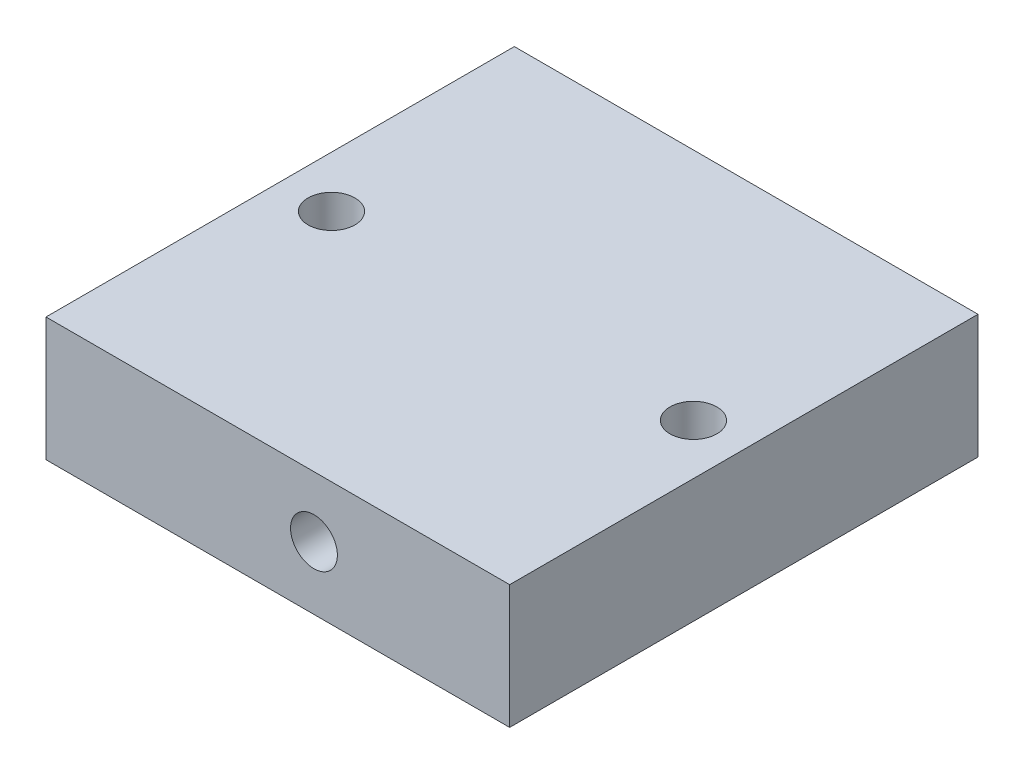
ISO-10303-21;
HEADER;
FILE_DESCRIPTION(('STEP AP214'),'2;1');
FILE_NAME('part.step','',(''),(''),'','','');
FILE_SCHEMA(('AUTOMOTIVE_DESIGN { 1 0 10303 214 1 1 1 1 }'));
ENDSEC;
DATA;
#1=APPLICATION_CONTEXT('core data for automotive mechanical design processes');
#2=APPLICATION_PROTOCOL_DEFINITION('international standard','automotive_design',2000,#1);
#3=PRODUCT_CONTEXT('',#1,'mechanical');
#4=PRODUCT('Part','Part','',(#3));
#5=PRODUCT_RELATED_PRODUCT_CATEGORY('part','',(#4));
#6=PRODUCT_DEFINITION_FORMATION('','',#4);
#7=PRODUCT_DEFINITION_CONTEXT('part definition',#1,'design');
#8=PRODUCT_DEFINITION('design','',#6,#7);
#9=PRODUCT_DEFINITION_SHAPE('','',#8);
#10=(LENGTH_UNIT() NAMED_UNIT(*) SI_UNIT(.MILLI.,.METRE.));
#11=(NAMED_UNIT(*) PLANE_ANGLE_UNIT() SI_UNIT($,.RADIAN.));
#12=(NAMED_UNIT(*) SI_UNIT($,.STERADIAN.) SOLID_ANGLE_UNIT());
#13=UNCERTAINTY_MEASURE_WITH_UNIT(LENGTH_MEASURE(1.E-05),#10,'distance_accuracy_value','');
#14=(GEOMETRIC_REPRESENTATION_CONTEXT(3) GLOBAL_UNCERTAINTY_ASSIGNED_CONTEXT((#13)) GLOBAL_UNIT_ASSIGNED_CONTEXT((#10,
#11,#12)) REPRESENTATION_CONTEXT('',''));
#15=CARTESIAN_POINT('',(0.,0.,0.));
#16=DIRECTION('',(0.,0.,1.));
#17=DIRECTION('',(1.,0.,0.));
#18=AXIS2_PLACEMENT_3D('',#15,#16,#17);
#19=CARTESIAN_POINT('',(247.5,132.,250.));
#20=DIRECTION('',(-1.,0.,0.));
#21=DIRECTION('',(0.,0.,1.));
#22=AXIS2_PLACEMENT_3D('',#19,#20,#21);
#23=PLANE('',#22);
#24=DIRECTION('',(0.,0.,-1.));
#25=VECTOR('',#24,1.);
#26=CARTESIAN_POINT('',(247.5,0.,250.));
#27=LINE('',#26,#25);
#28=CARTESIAN_POINT('',(247.5,0.,250.));
#29=VERTEX_POINT('',#28);
#30=CARTESIAN_POINT('',(247.5,0.,-250.));
#31=VERTEX_POINT('',#30);
#32=EDGE_CURVE('E97',#29,#31,#27,.T.);
#33=ORIENTED_EDGE('',*,*,#32,.T.);
#34=DIRECTION('',(0.,-1.,0.));
#35=VECTOR('',#34,1.);
#36=CARTESIAN_POINT('',(247.5,132.,-250.));
#37=LINE('',#36,#35);
#38=CARTESIAN_POINT('',(247.5,132.,-250.));
#39=VERTEX_POINT('',#38);
#40=EDGE_CURVE('E11',#39,#31,#37,.T.);
#41=ORIENTED_EDGE('',*,*,#40,.F.);
#42=DIRECTION('',(0.,0.,-1.));
#43=VECTOR('',#42,1.);
#44=CARTESIAN_POINT('',(247.5,132.,250.));
#45=LINE('',#44,#43);
#46=CARTESIAN_POINT('',(247.5,132.,250.));
#47=VERTEX_POINT('',#46);
#48=EDGE_CURVE('E85',#47,#39,#45,.T.);
#49=ORIENTED_EDGE('',*,*,#48,.F.);
#50=DIRECTION('',(0.,-1.,0.));
#51=VECTOR('',#50,1.);
#52=CARTESIAN_POINT('',(247.5,132.,250.));
#53=LINE('',#52,#51);
#54=EDGE_CURVE('E93',#47,#29,#53,.T.);
#55=ORIENTED_EDGE('',*,*,#54,.T.);
#56=EDGE_LOOP('',(#33,#41,#49,#55));
#57=FACE_BOUND('',#56,.T.);
#58=ADVANCED_FACE('F34',(#57),#23,.F.);
#59=CARTESIAN_POINT('',(-247.5,132.,-250.));
#60=DIRECTION('',(0.,0.,1.));
#61=DIRECTION('',(1.,0.,0.));
#62=AXIS2_PLACEMENT_3D('',#59,#60,#61);
#63=PLANE('',#62);
#64=CARTESIAN_POINT('',(38.5868696304628,67.2852031451336,-250.));
#65=DIRECTION('',(0.,0.,1.));
#66=DIRECTION('',(1.,0.,0.));
#67=AXIS2_PLACEMENT_3D('',#64,#65,#66);
#68=CIRCLE('',#67,25.);
#69=CARTESIAN_POINT('',(63.5868696304628,67.2852031451336,-250.));
#70=VERTEX_POINT('',#69);
#71=EDGE_CURVE('E100',#70,#70,#68,.T.);
#72=ORIENTED_EDGE('',*,*,#71,.T.);
#73=EDGE_LOOP('',(#72));
#74=FACE_BOUND('',#73,.T.);
#75=DIRECTION('',(-1.,0.,0.));
#76=VECTOR('',#75,1.);
#77=CARTESIAN_POINT('',(-247.5,0.,-250.));
#78=LINE('',#77,#76);
#79=CARTESIAN_POINT('',(-247.5,0.,-250.));
#80=VERTEX_POINT('',#79);
#81=EDGE_CURVE('E89',#31,#80,#78,.T.);
#82=ORIENTED_EDGE('',*,*,#81,.T.);
#83=DIRECTION('',(0.,-1.,0.));
#84=VECTOR('',#83,1.);
#85=CARTESIAN_POINT('',(-247.5,132.,-250.));
#86=LINE('',#85,#84);
#87=CARTESIAN_POINT('',(-247.5,132.,-250.));
#88=VERTEX_POINT('',#87);
#89=EDGE_CURVE('E42',#88,#80,#86,.T.);
#90=ORIENTED_EDGE('',*,*,#89,.F.);
#91=DIRECTION('',(-1.,0.,0.));
#92=VECTOR('',#91,1.);
#93=CARTESIAN_POINT('',(-247.5,132.,-250.));
#94=LINE('',#93,#92);
#95=EDGE_CURVE('E80',#39,#88,#94,.T.);
#96=ORIENTED_EDGE('',*,*,#95,.F.);
#97=ORIENTED_EDGE('',*,*,#40,.T.);
#98=EDGE_LOOP('',(#82,#90,#96,#97));
#99=FACE_BOUND('',#98,.T.);
#100=ADVANCED_FACE('F88',(#74,#99),#63,.F.);
#101=CARTESIAN_POINT('',(-247.5,132.,250.));
#102=DIRECTION('',(1.,0.,0.));
#103=DIRECTION('',(0.,0.,-1.));
#104=AXIS2_PLACEMENT_3D('',#101,#102,#103);
#105=PLANE('',#104);
#106=DIRECTION('',(0.,0.,1.));
#107=VECTOR('',#106,1.);
#108=CARTESIAN_POINT('',(-247.5,0.,250.));
#109=LINE('',#108,#107);
#110=CARTESIAN_POINT('',(-247.5,0.,250.));
#111=VERTEX_POINT('',#110);
#112=EDGE_CURVE('E67',#80,#111,#109,.T.);
#113=ORIENTED_EDGE('',*,*,#112,.T.);
#114=DIRECTION('',(0.,-1.,0.));
#115=VECTOR('',#114,1.);
#116=CARTESIAN_POINT('',(-247.5,132.,250.));
#117=LINE('',#116,#115);
#118=CARTESIAN_POINT('',(-247.5,132.,250.));
#119=VERTEX_POINT('',#118);
#120=EDGE_CURVE('E90',#119,#111,#117,.T.);
#121=ORIENTED_EDGE('',*,*,#120,.F.);
#122=DIRECTION('',(0.,0.,1.));
#123=VECTOR('',#122,1.);
#124=CARTESIAN_POINT('',(-247.5,132.,250.));
#125=LINE('',#124,#123);
#126=EDGE_CURVE('E83',#88,#119,#125,.T.);
#127=ORIENTED_EDGE('',*,*,#126,.F.);
#128=ORIENTED_EDGE('',*,*,#89,.T.);
#129=EDGE_LOOP('',(#113,#121,#127,#128));
#130=FACE_BOUND('',#129,.T.);
#131=ADVANCED_FACE('F91',(#130),#105,.F.);
#132=CARTESIAN_POINT('',(-247.5,132.,250.));
#133=DIRECTION('',(0.,0.,-1.));
#134=DIRECTION('',(-1.,0.,0.));
#135=AXIS2_PLACEMENT_3D('',#132,#133,#134);
#136=PLANE('',#135);
#137=CARTESIAN_POINT('',(38.5868696304628,67.2852031451336,250.));
#138=DIRECTION('',(0.,0.,1.));
#139=DIRECTION('',(1.,0.,0.));
#140=AXIS2_PLACEMENT_3D('',#137,#138,#139);
#141=CIRCLE('',#140,25.);
#142=CARTESIAN_POINT('',(63.5868696304628,67.2852031451336,250.));
#143=VERTEX_POINT('',#142);
#144=EDGE_CURVE('E111',#143,#143,#141,.T.);
#145=ORIENTED_EDGE('',*,*,#144,.F.);
#146=EDGE_LOOP('',(#145));
#147=FACE_BOUND('',#146,.T.);
#148=DIRECTION('',(1.,0.,0.));
#149=VECTOR('',#148,1.);
#150=CARTESIAN_POINT('',(-247.5,0.,250.));
#151=LINE('',#150,#149);
#152=EDGE_CURVE('E73',#111,#29,#151,.T.);
#153=ORIENTED_EDGE('',*,*,#152,.T.);
#154=ORIENTED_EDGE('',*,*,#54,.F.);
#155=DIRECTION('',(1.,0.,0.));
#156=VECTOR('',#155,1.);
#157=CARTESIAN_POINT('',(-247.5,132.,250.));
#158=LINE('',#157,#156);
#159=EDGE_CURVE('E50',#119,#47,#158,.T.);
#160=ORIENTED_EDGE('',*,*,#159,.F.);
#161=ORIENTED_EDGE('',*,*,#120,.T.);
#162=EDGE_LOOP('',(#153,#154,#160,#161));
#163=FACE_BOUND('',#162,.T.);
#164=ADVANCED_FACE('F105',(#147,#163),#136,.F.);
#165=CARTESIAN_POINT('',(0.,132.,0.));
#166=DIRECTION('',(0.,-1.,0.));
#167=DIRECTION('',(0.,0.,-1.));
#168=AXIS2_PLACEMENT_3D('',#165,#166,#167);
#169=PLANE('',#168);
#170=CARTESIAN_POINT('',(-192.698108673412,132.,0.));
#171=DIRECTION('',(0.,-1.,0.));
#172=DIRECTION('',(0.,0.,-1.));
#173=AXIS2_PLACEMENT_3D('',#170,#171,#172);
#174=CIRCLE('',#173,25.);
#175=CARTESIAN_POINT('',(-192.698108673412,132.,-25.));
#176=VERTEX_POINT('',#175);
#177=EDGE_CURVE('E120',#176,#176,#174,.T.);
#178=ORIENTED_EDGE('',*,*,#177,.T.);
#179=EDGE_LOOP('',(#178));
#180=FACE_BOUND('',#179,.T.);
#181=CARTESIAN_POINT('',(193.717960242815,132.,0.));
#182=DIRECTION('',(0.,-1.,0.));
#183=DIRECTION('',(0.,0.,-1.));
#184=AXIS2_PLACEMENT_3D('',#181,#182,#183);
#185=CIRCLE('',#184,25.);
#186=CARTESIAN_POINT('',(193.717960242815,132.,-25.));
#187=VERTEX_POINT('',#186);
#188=EDGE_CURVE('E114',#187,#187,#185,.T.);
#189=ORIENTED_EDGE('',*,*,#188,.T.);
#190=EDGE_LOOP('',(#189));
#191=FACE_BOUND('',#190,.T.);
#192=ORIENTED_EDGE('',*,*,#48,.T.);
#193=ORIENTED_EDGE('',*,*,#95,.T.);
#194=ORIENTED_EDGE('',*,*,#126,.T.);
#195=ORIENTED_EDGE('',*,*,#159,.T.);
#196=EDGE_LOOP('',(#192,#193,#194,#195));
#197=FACE_BOUND('',#196,.T.);
#198=ADVANCED_FACE('F81',(#180,#191,#197),#169,.F.);
#199=CARTESIAN_POINT('',(0.,0.,0.));
#200=DIRECTION('',(0.,-1.,0.));
#201=DIRECTION('',(0.,0.,-1.));
#202=AXIS2_PLACEMENT_3D('',#199,#200,#201);
#203=PLANE('',#202);
#204=CARTESIAN_POINT('',(-192.698108673412,0.,0.));
#205=DIRECTION('',(0.,-1.,0.));
#206=DIRECTION('',(0.,0.,-1.));
#207=AXIS2_PLACEMENT_3D('',#204,#205,#206);
#208=CIRCLE('',#207,25.);
#209=CARTESIAN_POINT('',(-192.698108673412,0.,-25.));
#210=VERTEX_POINT('',#209);
#211=EDGE_CURVE('E123',#210,#210,#208,.T.);
#212=ORIENTED_EDGE('',*,*,#211,.F.);
#213=EDGE_LOOP('',(#212));
#214=FACE_BOUND('',#213,.T.);
#215=CARTESIAN_POINT('',(193.717960242815,0.,0.));
#216=DIRECTION('',(0.,-1.,0.));
#217=DIRECTION('',(0.,0.,-1.));
#218=AXIS2_PLACEMENT_3D('',#215,#216,#217);
#219=CIRCLE('',#218,25.);
#220=CARTESIAN_POINT('',(193.717960242815,0.,-25.));
#221=VERTEX_POINT('',#220);
#222=EDGE_CURVE('E117',#221,#221,#219,.T.);
#223=ORIENTED_EDGE('',*,*,#222,.F.);
#224=EDGE_LOOP('',(#223));
#225=FACE_BOUND('',#224,.T.);
#226=ORIENTED_EDGE('',*,*,#32,.F.);
#227=ORIENTED_EDGE('',*,*,#152,.F.);
#228=ORIENTED_EDGE('',*,*,#112,.F.);
#229=ORIENTED_EDGE('',*,*,#81,.F.);
#230=EDGE_LOOP('',(#226,#227,#228,#229));
#231=FACE_BOUND('',#230,.T.);
#232=ADVANCED_FACE('F108',(#214,#225,#231),#203,.T.);
#233=CARTESIAN_POINT('',(38.5868696304628,67.2852031451336,-250.));
#234=DIRECTION('',(0.,0.,1.));
#235=DIRECTION('',(1.,0.,0.));
#236=AXIS2_PLACEMENT_3D('',#233,#234,#235);
#237=CYLINDRICAL_SURFACE('',#236,25.);
#238=ORIENTED_EDGE('',*,*,#71,.F.);
#239=EDGE_LOOP('',(#238));
#240=FACE_BOUND('',#239,.T.);
#241=ORIENTED_EDGE('',*,*,#144,.T.);
#242=EDGE_LOOP('',(#241));
#243=FACE_BOUND('',#242,.T.);
#244=ADVANCED_FACE('F140',(#240,#243),#237,.F.);
#245=CARTESIAN_POINT('',(193.717960242815,132.,0.));
#246=DIRECTION('',(0.,-1.,0.));
#247=DIRECTION('',(0.,0.,-1.));
#248=AXIS2_PLACEMENT_3D('',#245,#246,#247);
#249=CYLINDRICAL_SURFACE('',#248,25.);
#250=ORIENTED_EDGE('',*,*,#188,.F.);
#251=EDGE_LOOP('',(#250));
#252=FACE_BOUND('',#251,.T.);
#253=ORIENTED_EDGE('',*,*,#222,.T.);
#254=EDGE_LOOP('',(#253));
#255=FACE_BOUND('',#254,.T.);
#256=ADVANCED_FACE('F134',(#252,#255),#249,.F.);
#257=CARTESIAN_POINT('',(-192.698108673412,132.,0.));
#258=DIRECTION('',(0.,-1.,0.));
#259=DIRECTION('',(0.,0.,-1.));
#260=AXIS2_PLACEMENT_3D('',#257,#258,#259);
#261=CYLINDRICAL_SURFACE('',#260,25.);
#262=ORIENTED_EDGE('',*,*,#177,.F.);
#263=EDGE_LOOP('',(#262));
#264=FACE_BOUND('',#263,.T.);
#265=ORIENTED_EDGE('',*,*,#211,.T.);
#266=EDGE_LOOP('',(#265));
#267=FACE_BOUND('',#266,.T.);
#268=ADVANCED_FACE('F131',(#264,#267),#261,.F.);
#269=CLOSED_SHELL('',(#58,#100,#131,#164,#198,#232,#244,#256,#268));
#270=MANIFOLD_SOLID_BREP('B2',#269);
#271=ADVANCED_BREP_SHAPE_REPRESENTATION('',(#18,#270),#14);
#272=SHAPE_DEFINITION_REPRESENTATION(#9,#271);
ENDSEC;
END-ISO-10303-21;
